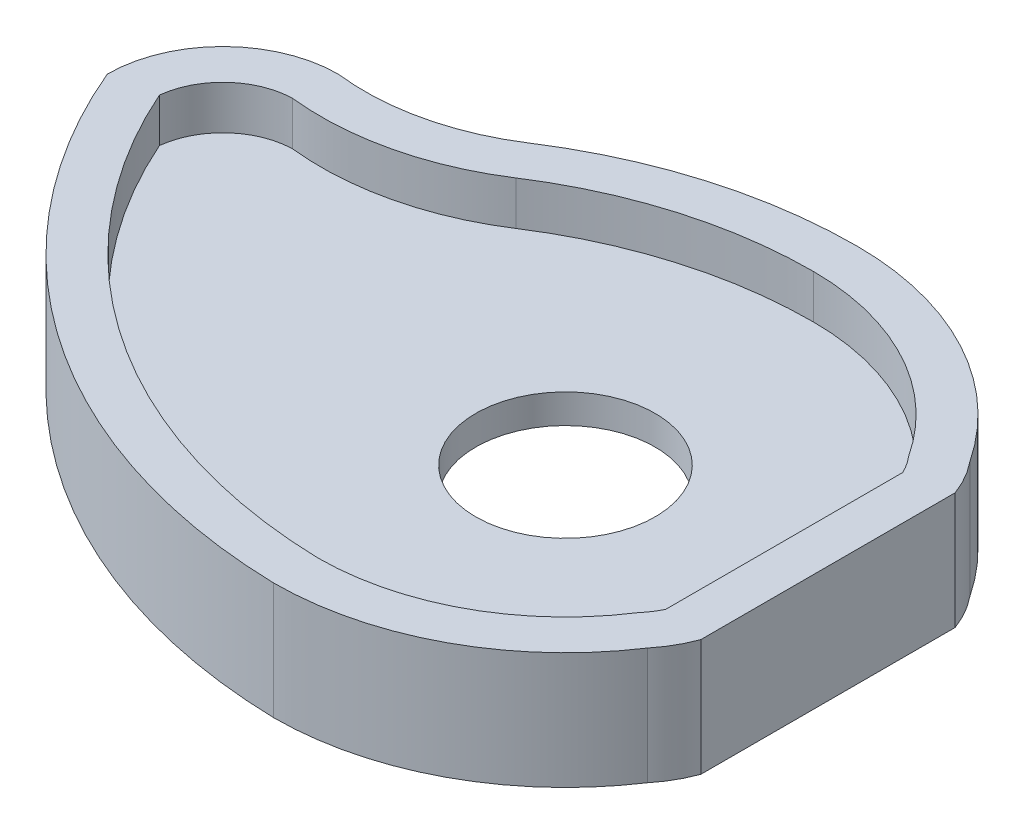
ISO-10303-21;
HEADER;
FILE_DESCRIPTION(('STEP AP214'),'2;1');
FILE_NAME('part.step','',(''),(''),'','','');
FILE_SCHEMA(('AUTOMOTIVE_DESIGN { 1 0 10303 214 1 1 1 1 }'));
ENDSEC;
DATA;
#1=APPLICATION_CONTEXT('core data for automotive mechanical design processes');
#2=APPLICATION_PROTOCOL_DEFINITION('international standard','automotive_design',2000,#1);
#3=PRODUCT_CONTEXT('',#1,'mechanical');
#4=PRODUCT('Part','Part','',(#3));
#5=PRODUCT_RELATED_PRODUCT_CATEGORY('part','',(#4));
#6=PRODUCT_DEFINITION_FORMATION('','',#4);
#7=PRODUCT_DEFINITION_CONTEXT('part definition',#1,'design');
#8=PRODUCT_DEFINITION('design','',#6,#7);
#9=PRODUCT_DEFINITION_SHAPE('','',#8);
#10=(LENGTH_UNIT() NAMED_UNIT(*) SI_UNIT(.MILLI.,.METRE.));
#11=(NAMED_UNIT(*) PLANE_ANGLE_UNIT() SI_UNIT($,.RADIAN.));
#12=(NAMED_UNIT(*) SI_UNIT($,.STERADIAN.) SOLID_ANGLE_UNIT());
#13=UNCERTAINTY_MEASURE_WITH_UNIT(LENGTH_MEASURE(1.E-05),#10,'distance_accuracy_value','');
#14=(GEOMETRIC_REPRESENTATION_CONTEXT(3) GLOBAL_UNCERTAINTY_ASSIGNED_CONTEXT((#13)) GLOBAL_UNIT_ASSIGNED_CONTEXT((#10,
#11,#12)) REPRESENTATION_CONTEXT('',''));
#15=CARTESIAN_POINT('',(0.,0.,0.));
#16=DIRECTION('',(0.,0.,1.));
#17=DIRECTION('',(1.,0.,0.));
#18=AXIS2_PLACEMENT_3D('',#15,#16,#17);
#19=CARTESIAN_POINT('',(0.,6.35,0.));
#20=DIRECTION('',(0.,1.,0.));
#21=DIRECTION('',(0.,0.,1.));
#22=AXIS2_PLACEMENT_3D('',#19,#20,#21);
#23=PLANE('',#22);
#24=CARTESIAN_POINT('',(0.,6.35,0.));
#25=DIRECTION('',(0.,1.,0.));
#26=DIRECTION('',(0.,0.,1.));
#27=AXIS2_PLACEMENT_3D('',#24,#25,#26);
#28=CIRCLE('',#27,39.05);
#29=CARTESIAN_POINT('',(0.,6.35,39.05));
#30=VERTEX_POINT('',#29);
#31=EDGE_CURVE('E277',#30,#30,#28,.T.);
#32=ORIENTED_EDGE('',*,*,#31,.F.);
#33=EDGE_LOOP('',(#32));
#34=FACE_BOUND('',#33,.T.);
#35=CARTESIAN_POINT('',(66.5686684634042,6.35,-37.9695149297598));
#36=DIRECTION('',(0.,1.,0.));
#37=DIRECTION('',(0.,0.,1.));
#38=AXIS2_PLACEMENT_3D('',#35,#36,#37);
#39=CIRCLE('',#38,31.75);
#40=CARTESIAN_POINT('',(95.25,6.35,-51.5872871883884));
#41=VERTEX_POINT('',#40);
#42=CARTESIAN_POINT('',(90.5312902277407,6.35,-58.7987073812051));
#43=VERTEX_POINT('',#42);
#44=EDGE_CURVE('E95',#41,#43,#39,.T.);
#45=ORIENTED_EDGE('',*,*,#44,.T.);
#46=CARTESIAN_POINT('',(0.,6.35,0.));
#47=DIRECTION('',(0.,1.,0.));
#48=DIRECTION('',(0.,0.,1.));
#49=AXIS2_PLACEMENT_3D('',#46,#47,#48);
#50=CIRCLE('',#49,107.95);
#51=CARTESIAN_POINT('',(0.,6.35,-107.95));
#52=VERTEX_POINT('',#51);
#53=EDGE_CURVE('E131',#43,#52,#50,.T.);
#54=ORIENTED_EDGE('',*,*,#53,.T.);
#55=CARTESIAN_POINT('',(0.,6.35,76.2));
#56=DIRECTION('',(0.,1.,0.));
#57=DIRECTION('',(0.,0.,1.));
#58=AXIS2_PLACEMENT_3D('',#55,#56,#57);
#59=CIRCLE('',#58,184.15);
#60=CARTESIAN_POINT('',(-99.98325505403,6.35,-78.4433678138212));
#61=VERTEX_POINT('',#60);
#62=EDGE_CURVE('E134',#52,#61,#59,.T.);
#63=ORIENTED_EDGE('',*,*,#62,.T.);
#64=CARTESIAN_POINT('',(-165.48952560667,6.35,-179.761436381497));
#65=DIRECTION('',(0.,1.,0.));
#66=DIRECTION('',(0.,0.,1.));
#67=AXIS2_PLACEMENT_3D('',#64,#65,#66);
#68=CIRCLE('',#67,120.65);
#69=CARTESIAN_POINT('',(-178.772455635616,6.35,-59.8448559188851));
#70=VERTEX_POINT('',#69);
#71=EDGE_CURVE('E137',#70,#61,#68,.T.);
#72=ORIENTED_EDGE('',*,*,#71,.F.);
#73=CARTESIAN_POINT('',(-177.8,6.35,-28.63));
#74=DIRECTION('',(0.,1.,0.));
#75=DIRECTION('',(0.,0.,1.));
#76=AXIS2_PLACEMENT_3D('',#73,#74,#75);
#77=CIRCLE('',#76,31.23);
#78=CARTESIAN_POINT('',(-208.836282510466,6.35,-32.1030487947266));
#79=VERTEX_POINT('',#78);
#80=EDGE_CURVE('E139',#79,#70,#77,.F.);
#81=ORIENTED_EDGE('',*,*,#80,.F.);
#82=CARTESIAN_POINT('',(6.12906951448226,6.35,-126.926041411445));
#83=DIRECTION('',(0.,1.,0.));
#84=DIRECTION('',(0.,0.,1.));
#85=AXIS2_PLACEMENT_3D('',#82,#83,#84);
#86=CIRCLE('',#85,234.95);
#87=CARTESIAN_POINT('',(0.225016949552153,6.35,107.949765480859));
#88=VERTEX_POINT('',#87);
#89=EDGE_CURVE('E142',#79,#88,#86,.T.);
#90=ORIENTED_EDGE('',*,*,#89,.T.);
#91=CARTESIAN_POINT('',(0.,6.35,0.));
#92=DIRECTION('',(0.,1.,0.));
#93=DIRECTION('',(0.,0.,1.));
#94=AXIS2_PLACEMENT_3D('',#91,#92,#93);
#95=CIRCLE('',#94,107.95);
#96=CARTESIAN_POINT('',(90.5312902277406,6.35,58.7987073812052));
#97=VERTEX_POINT('',#96);
#98=EDGE_CURVE('E145',#88,#97,#95,.T.);
#99=ORIENTED_EDGE('',*,*,#98,.T.);
#100=CARTESIAN_POINT('',(66.5686684634042,6.35,37.9695149297598));
#101=DIRECTION('',(0.,1.,0.));
#102=DIRECTION('',(0.,0.,1.));
#103=AXIS2_PLACEMENT_3D('',#100,#101,#102);
#104=CIRCLE('',#103,31.75);
#105=CARTESIAN_POINT('',(95.25,6.35,51.5872871883884));
#106=VERTEX_POINT('',#105);
#107=EDGE_CURVE('E49',#106,#97,#104,.F.);
#108=ORIENTED_EDGE('',*,*,#107,.F.);
#109=DIRECTION('',(0.,0.,1.));
#110=VECTOR('',#109,1.);
#111=CARTESIAN_POINT('',(95.25,6.35,0.));
#112=LINE('',#111,#110);
#113=EDGE_CURVE('E11',#41,#106,#112,.T.);
#114=ORIENTED_EDGE('',*,*,#113,.F.);
#115=EDGE_LOOP('',(#45,#54,#63,#72,#81,#90,#99,#108,#114));
#116=FACE_BOUND('',#115,.T.);
#117=ADVANCED_FACE('F39',(#34,#116),#23,.T.);
#118=CARTESIAN_POINT('',(0.,25.4,0.));
#119=DIRECTION('',(0.,-1.,0.));
#120=DIRECTION('',(0.,0.,-1.));
#121=AXIS2_PLACEMENT_3D('',#118,#119,#120);
#122=CYLINDRICAL_SURFACE('',#121,107.95);
#123=CARTESIAN_POINT('',(0.,-6.35,0.));
#124=DIRECTION('',(0.,1.,0.));
#125=DIRECTION('',(0.,0.,1.));
#126=AXIS2_PLACEMENT_3D('',#123,#124,#125);
#127=CIRCLE('',#126,107.95);
#128=CARTESIAN_POINT('',(90.5312902277407,-6.35,-58.7987073812051));
#129=VERTEX_POINT('',#128);
#130=CARTESIAN_POINT('',(0.,-6.35,-107.95));
#131=VERTEX_POINT('',#130);
#132=EDGE_CURVE('E151',#129,#131,#127,.T.);
#133=ORIENTED_EDGE('',*,*,#132,.T.);
#134=DIRECTION('',(0.,-1.,0.));
#135=VECTOR('',#134,1.);
#136=CARTESIAN_POINT('',(0.,25.4,-107.95));
#137=LINE('',#136,#135);
#138=CARTESIAN_POINT('',(0.,-25.4,-107.95));
#139=VERTEX_POINT('',#138);
#140=EDGE_CURVE('E272',#131,#139,#137,.T.);
#141=ORIENTED_EDGE('',*,*,#140,.T.);
#142=CARTESIAN_POINT('',(0.,-25.4,0.));
#143=DIRECTION('',(0.,1.,0.));
#144=DIRECTION('',(0.,0.,1.));
#145=AXIS2_PLACEMENT_3D('',#142,#143,#144);
#146=CIRCLE('',#145,107.95);
#147=CARTESIAN_POINT('',(90.5312902277407,-25.4,-58.7987073812051));
#148=VERTEX_POINT('',#147);
#149=EDGE_CURVE('E273',#148,#139,#146,.T.);
#150=ORIENTED_EDGE('',*,*,#149,.F.);
#151=DIRECTION('',(0.,-1.,0.));
#152=VECTOR('',#151,1.);
#153=CARTESIAN_POINT('',(90.5312902277407,25.4,-58.7987073812051));
#154=LINE('',#153,#152);
#155=EDGE_CURVE('E124',#129,#148,#154,.T.);
#156=ORIENTED_EDGE('',*,*,#155,.F.);
#157=EDGE_LOOP('',(#133,#141,#150,#156));
#158=FACE_BOUND('',#157,.T.);
#159=ADVANCED_FACE('F378',(#158),#122,.F.);
#160=CARTESIAN_POINT('',(66.5686684634042,25.4,-37.9695149297598));
#161=DIRECTION('',(0.,-1.,0.));
#162=DIRECTION('',(0.,0.,-1.));
#163=AXIS2_PLACEMENT_3D('',#160,#161,#162);
#164=CYLINDRICAL_SURFACE('',#163,31.75);
#165=CARTESIAN_POINT('',(66.5686684634042,-6.35,-37.9695149297598));
#166=DIRECTION('',(0.,1.,0.));
#167=DIRECTION('',(0.,0.,1.));
#168=AXIS2_PLACEMENT_3D('',#165,#166,#167);
#169=CIRCLE('',#168,31.75);
#170=CARTESIAN_POINT('',(95.25,-6.35,-51.5872871883884));
#171=VERTEX_POINT('',#170);
#172=EDGE_CURVE('E90',#171,#129,#169,.T.);
#173=ORIENTED_EDGE('',*,*,#172,.T.);
#174=ORIENTED_EDGE('',*,*,#155,.T.);
#175=CARTESIAN_POINT('',(66.5686684634042,-25.4,-37.9695149297598));
#176=DIRECTION('',(0.,1.,0.));
#177=DIRECTION('',(0.,0.,1.));
#178=AXIS2_PLACEMENT_3D('',#175,#176,#177);
#179=CIRCLE('',#178,31.75);
#180=CARTESIAN_POINT('',(95.25,-25.4,-51.5872871883884));
#181=VERTEX_POINT('',#180);
#182=EDGE_CURVE('E276',#181,#148,#179,.T.);
#183=ORIENTED_EDGE('',*,*,#182,.F.);
#184=DIRECTION('',(0.,-1.,0.));
#185=VECTOR('',#184,1.);
#186=CARTESIAN_POINT('',(95.25,25.4,-51.5872871883884));
#187=LINE('',#186,#185);
#188=EDGE_CURVE('E116',#171,#181,#187,.T.);
#189=ORIENTED_EDGE('',*,*,#188,.F.);
#190=EDGE_LOOP('',(#173,#174,#183,#189));
#191=FACE_BOUND('',#190,.T.);
#192=ADVANCED_FACE('F477',(#191),#164,.F.);
#193=CARTESIAN_POINT('',(95.25,25.4,0.));
#194=DIRECTION('',(1.,0.,0.));
#195=DIRECTION('',(0.,0.,-1.));
#196=AXIS2_PLACEMENT_3D('',#193,#194,#195);
#197=PLANE('',#196);
#198=DIRECTION('',(0.,-1.,0.));
#199=VECTOR('',#198,1.);
#200=CARTESIAN_POINT('',(95.25,25.4,51.5872871883884));
#201=LINE('',#200,#199);
#202=CARTESIAN_POINT('',(95.25,-6.35,51.5872871883884));
#203=VERTEX_POINT('',#202);
#204=CARTESIAN_POINT('',(95.25,-25.4,51.5872871883884));
#205=VERTEX_POINT('',#204);
#206=EDGE_CURVE('E102',#203,#205,#201,.T.);
#207=ORIENTED_EDGE('',*,*,#206,.F.);
#208=DIRECTION('',(0.,0.,1.));
#209=VECTOR('',#208,1.);
#210=CARTESIAN_POINT('',(95.25,-6.35,0.));
#211=LINE('',#210,#209);
#212=EDGE_CURVE('E85',#171,#203,#211,.T.);
#213=ORIENTED_EDGE('',*,*,#212,.F.);
#214=ORIENTED_EDGE('',*,*,#188,.T.);
#215=DIRECTION('',(0.,0.,1.));
#216=VECTOR('',#215,1.);
#217=CARTESIAN_POINT('',(95.25,-25.4,0.));
#218=LINE('',#217,#216);
#219=EDGE_CURVE('E110',#181,#205,#218,.T.);
#220=ORIENTED_EDGE('',*,*,#219,.T.);
#221=EDGE_LOOP('',(#207,#213,#214,#220));
#222=FACE_BOUND('',#221,.T.);
#223=ADVANCED_FACE('F108',(#222),#197,.F.);
#224=CARTESIAN_POINT('',(66.5686684634042,25.4,37.9695149297598));
#225=DIRECTION('',(0.,-1.,0.));
#226=DIRECTION('',(0.,0.,-1.));
#227=AXIS2_PLACEMENT_3D('',#224,#225,#226);
#228=CYLINDRICAL_SURFACE('',#227,31.75);
#229=DIRECTION('',(0.,-1.,0.));
#230=VECTOR('',#229,1.);
#231=CARTESIAN_POINT('',(90.5312902277406,25.4,58.7987073812052));
#232=LINE('',#231,#230);
#233=CARTESIAN_POINT('',(90.5312902277406,-6.35,58.7987073812052));
#234=VERTEX_POINT('',#233);
#235=CARTESIAN_POINT('',(90.5312902277406,-25.4,58.7987073812052));
#236=VERTEX_POINT('',#235);
#237=EDGE_CURVE('E105',#234,#236,#232,.T.);
#238=ORIENTED_EDGE('',*,*,#237,.F.);
#239=CARTESIAN_POINT('',(66.5686684634042,-6.35,37.9695149297598));
#240=DIRECTION('',(0.,1.,0.));
#241=DIRECTION('',(0.,0.,1.));
#242=AXIS2_PLACEMENT_3D('',#239,#240,#241);
#243=CIRCLE('',#242,31.75);
#244=EDGE_CURVE('E87',#203,#234,#243,.F.);
#245=ORIENTED_EDGE('',*,*,#244,.F.);
#246=ORIENTED_EDGE('',*,*,#206,.T.);
#247=CARTESIAN_POINT('',(66.5686684634042,-25.4,37.9695149297598));
#248=DIRECTION('',(0.,1.,0.));
#249=DIRECTION('',(0.,0.,1.));
#250=AXIS2_PLACEMENT_3D('',#247,#248,#249);
#251=CIRCLE('',#250,31.75);
#252=EDGE_CURVE('E281',#205,#236,#251,.F.);
#253=ORIENTED_EDGE('',*,*,#252,.T.);
#254=EDGE_LOOP('',(#238,#245,#246,#253));
#255=FACE_BOUND('',#254,.T.);
#256=ADVANCED_FACE('F99',(#255),#228,.F.);
#257=CARTESIAN_POINT('',(0.,25.4,0.));
#258=DIRECTION('',(0.,-1.,0.));
#259=DIRECTION('',(0.,0.,-1.));
#260=AXIS2_PLACEMENT_3D('',#257,#258,#259);
#261=CYLINDRICAL_SURFACE('',#260,107.95);
#262=CARTESIAN_POINT('',(0.,-6.35,0.));
#263=DIRECTION('',(0.,1.,0.));
#264=DIRECTION('',(0.,0.,1.));
#265=AXIS2_PLACEMENT_3D('',#262,#263,#264);
#266=CIRCLE('',#265,107.95);
#267=CARTESIAN_POINT('',(0.225016949552153,-6.35,107.949765480859));
#268=VERTEX_POINT('',#267);
#269=EDGE_CURVE('E106',#268,#234,#266,.T.);
#270=ORIENTED_EDGE('',*,*,#269,.T.);
#271=ORIENTED_EDGE('',*,*,#237,.T.);
#272=CARTESIAN_POINT('',(0.,-25.4,0.));
#273=DIRECTION('',(0.,1.,0.));
#274=DIRECTION('',(0.,0.,1.));
#275=AXIS2_PLACEMENT_3D('',#272,#273,#274);
#276=CIRCLE('',#275,107.95);
#277=CARTESIAN_POINT('',(0.225016949552153,-25.4,107.949765480859));
#278=VERTEX_POINT('',#277);
#279=EDGE_CURVE('E283',#278,#236,#276,.T.);
#280=ORIENTED_EDGE('',*,*,#279,.F.);
#281=DIRECTION('',(0.,-1.,0.));
#282=VECTOR('',#281,1.);
#283=CARTESIAN_POINT('',(0.225016949552153,25.4,107.949765480859));
#284=LINE('',#283,#282);
#285=EDGE_CURVE('E172',#268,#278,#284,.T.);
#286=ORIENTED_EDGE('',*,*,#285,.F.);
#287=EDGE_LOOP('',(#270,#271,#280,#286));
#288=FACE_BOUND('',#287,.T.);
#289=ADVANCED_FACE('F168',(#288),#261,.F.);
#290=CARTESIAN_POINT('',(6.12906951448226,25.4,-126.926041411445));
#291=DIRECTION('',(0.,-1.,0.));
#292=DIRECTION('',(0.,0.,-1.));
#293=AXIS2_PLACEMENT_3D('',#290,#291,#292);
#294=CYLINDRICAL_SURFACE('',#293,234.95);
#295=CARTESIAN_POINT('',(6.12906951448226,-6.35,-126.926041411445));
#296=DIRECTION('',(0.,1.,0.));
#297=DIRECTION('',(0.,0.,1.));
#298=AXIS2_PLACEMENT_3D('',#295,#296,#297);
#299=CIRCLE('',#298,234.95);
#300=CARTESIAN_POINT('',(-208.836282510466,-6.35,-32.1030487947266));
#301=VERTEX_POINT('',#300);
#302=EDGE_CURVE('E163',#301,#268,#299,.T.);
#303=ORIENTED_EDGE('',*,*,#302,.T.);
#304=ORIENTED_EDGE('',*,*,#285,.T.);
#305=CARTESIAN_POINT('',(6.12906951448226,-25.4,-126.926041411445));
#306=DIRECTION('',(0.,1.,0.));
#307=DIRECTION('',(0.,0.,1.));
#308=AXIS2_PLACEMENT_3D('',#305,#306,#307);
#309=CIRCLE('',#308,234.95);
#310=CARTESIAN_POINT('',(-208.836282510466,-25.4,-32.1030487947266));
#311=VERTEX_POINT('',#310);
#312=EDGE_CURVE('E183',#311,#278,#309,.T.);
#313=ORIENTED_EDGE('',*,*,#312,.F.);
#314=DIRECTION('',(0.,-1.,0.));
#315=VECTOR('',#314,1.);
#316=CARTESIAN_POINT('',(-208.836282510466,25.4,-32.1030487947266));
#317=LINE('',#316,#315);
#318=EDGE_CURVE('E180',#301,#311,#317,.T.);
#319=ORIENTED_EDGE('',*,*,#318,.F.);
#320=EDGE_LOOP('',(#303,#304,#313,#319));
#321=FACE_BOUND('',#320,.T.);
#322=ADVANCED_FACE('F176',(#321),#294,.F.);
#323=CARTESIAN_POINT('',(-177.8,25.4,-28.63));
#324=DIRECTION('',(0.,-1.,0.));
#325=DIRECTION('',(0.,0.,-1.));
#326=AXIS2_PLACEMENT_3D('',#323,#324,#325);
#327=CYLINDRICAL_SURFACE('',#326,31.23);
#328=DIRECTION('',(0.,-1.,0.));
#329=VECTOR('',#328,1.);
#330=CARTESIAN_POINT('',(-178.772455635616,25.4,-59.8448559188851));
#331=LINE('',#330,#329);
#332=CARTESIAN_POINT('',(-178.772455635616,-6.35,-59.8448559188851));
#333=VERTEX_POINT('',#332);
#334=CARTESIAN_POINT('',(-178.772455635616,-25.4,-59.8448559188851));
#335=VERTEX_POINT('',#334);
#336=EDGE_CURVE('E192',#333,#335,#331,.T.);
#337=ORIENTED_EDGE('',*,*,#336,.F.);
#338=CARTESIAN_POINT('',(-177.8,-6.35,-28.63));
#339=DIRECTION('',(0.,1.,0.));
#340=DIRECTION('',(0.,0.,1.));
#341=AXIS2_PLACEMENT_3D('',#338,#339,#340);
#342=CIRCLE('',#341,31.23);
#343=EDGE_CURVE('E161',#301,#333,#342,.F.);
#344=ORIENTED_EDGE('',*,*,#343,.F.);
#345=ORIENTED_EDGE('',*,*,#318,.T.);
#346=CARTESIAN_POINT('',(-177.8,-25.4,-28.63));
#347=DIRECTION('',(0.,1.,0.));
#348=DIRECTION('',(0.,0.,1.));
#349=AXIS2_PLACEMENT_3D('',#346,#347,#348);
#350=CIRCLE('',#349,31.23);
#351=EDGE_CURVE('E287',#311,#335,#350,.F.);
#352=ORIENTED_EDGE('',*,*,#351,.T.);
#353=EDGE_LOOP('',(#337,#344,#345,#352));
#354=FACE_BOUND('',#353,.T.);
#355=ADVANCED_FACE('F495',(#354),#327,.F.);
#356=CARTESIAN_POINT('',(-165.48952560667,25.4,-179.761436381497));
#357=DIRECTION('',(0.,-1.,0.));
#358=DIRECTION('',(0.,0.,-1.));
#359=AXIS2_PLACEMENT_3D('',#356,#357,#358);
#360=CYLINDRICAL_SURFACE('',#359,120.65);
#361=DIRECTION('',(0.,-1.,0.));
#362=VECTOR('',#361,1.);
#363=CARTESIAN_POINT('',(-99.98325505403,25.4,-78.4433678138212));
#364=LINE('',#363,#362);
#365=CARTESIAN_POINT('',(-99.98325505403,-6.35,-78.4433678138212));
#366=VERTEX_POINT('',#365);
#367=CARTESIAN_POINT('',(-99.98325505403,-25.4,-78.4433678138212));
#368=VERTEX_POINT('',#367);
#369=EDGE_CURVE('E350',#366,#368,#364,.T.);
#370=ORIENTED_EDGE('',*,*,#369,.F.);
#371=CARTESIAN_POINT('',(-165.48952560667,-6.35,-179.761436381497));
#372=DIRECTION('',(0.,1.,0.));
#373=DIRECTION('',(0.,0.,1.));
#374=AXIS2_PLACEMENT_3D('',#371,#372,#373);
#375=CIRCLE('',#374,120.65);
#376=EDGE_CURVE('E158',#333,#366,#375,.T.);
#377=ORIENTED_EDGE('',*,*,#376,.F.);
#378=ORIENTED_EDGE('',*,*,#336,.T.);
#379=CARTESIAN_POINT('',(-165.48952560667,-25.4,-179.761436381497));
#380=DIRECTION('',(0.,1.,0.));
#381=DIRECTION('',(0.,0.,1.));
#382=AXIS2_PLACEMENT_3D('',#379,#380,#381);
#383=CIRCLE('',#382,120.65);
#384=EDGE_CURVE('E289',#335,#368,#383,.T.);
#385=ORIENTED_EDGE('',*,*,#384,.T.);
#386=EDGE_LOOP('',(#370,#377,#378,#385));
#387=FACE_BOUND('',#386,.T.);
#388=ADVANCED_FACE('F365',(#387),#360,.T.);
#389=CARTESIAN_POINT('',(0.,25.4,76.2));
#390=DIRECTION('',(0.,-1.,0.));
#391=DIRECTION('',(0.,0.,-1.));
#392=AXIS2_PLACEMENT_3D('',#389,#390,#391);
#393=CYLINDRICAL_SURFACE('',#392,184.15);
#394=CARTESIAN_POINT('',(0.,-6.35,76.2));
#395=DIRECTION('',(0.,1.,0.));
#396=DIRECTION('',(0.,0.,1.));
#397=AXIS2_PLACEMENT_3D('',#394,#395,#396);
#398=CIRCLE('',#397,184.15);
#399=EDGE_CURVE('E155',#131,#366,#398,.T.);
#400=ORIENTED_EDGE('',*,*,#399,.T.);
#401=ORIENTED_EDGE('',*,*,#369,.T.);
#402=CARTESIAN_POINT('',(0.,-25.4,76.2));
#403=DIRECTION('',(0.,1.,0.));
#404=DIRECTION('',(0.,0.,1.));
#405=AXIS2_PLACEMENT_3D('',#402,#403,#404);
#406=CIRCLE('',#405,184.15);
#407=EDGE_CURVE('E292',#139,#368,#406,.T.);
#408=ORIENTED_EDGE('',*,*,#407,.F.);
#409=ORIENTED_EDGE('',*,*,#140,.F.);
#410=EDGE_LOOP('',(#400,#401,#408,#409));
#411=FACE_BOUND('',#410,.T.);
#412=ADVANCED_FACE('F357',(#411),#393,.F.);
#413=CARTESIAN_POINT('',(-177.8,25.4,-28.63));
#414=DIRECTION('',(0.,-1.,0.));
#415=DIRECTION('',(0.,0.,-1.));
#416=AXIS2_PLACEMENT_3D('',#413,#414,#415);
#417=CYLINDRICAL_SURFACE('',#416,50.28);
#418=CARTESIAN_POINT('',(-177.8,-25.4,-28.63));
#419=DIRECTION('',(0.,1.,0.));
#420=DIRECTION('',(0.,0.,1.));
#421=AXIS2_PLACEMENT_3D('',#418,#419,#420);
#422=CIRCLE('',#421,50.28);
#423=CARTESIAN_POINT('',(-228.08,-25.4,-28.63));
#424=VERTEX_POINT('',#423);
#425=CARTESIAN_POINT('',(-177.8,-25.4,-78.91));
#426=VERTEX_POINT('',#425);
#427=EDGE_CURVE('E295',#424,#426,#422,.F.);
#428=ORIENTED_EDGE('',*,*,#427,.F.);
#429=DIRECTION('',(0.,-1.,0.));
#430=VECTOR('',#429,1.);
#431=CARTESIAN_POINT('',(-228.08,25.4,-28.63));
#432=LINE('',#431,#430);
#433=CARTESIAN_POINT('',(-228.08,25.4,-28.63));
#434=VERTEX_POINT('',#433);
#435=EDGE_CURVE('E152',#434,#424,#432,.T.);
#436=ORIENTED_EDGE('',*,*,#435,.F.);
#437=CARTESIAN_POINT('',(-177.8,25.4,-28.63));
#438=DIRECTION('',(0.,1.,0.));
#439=DIRECTION('',(0.,0.,1.));
#440=AXIS2_PLACEMENT_3D('',#437,#438,#439);
#441=CIRCLE('',#440,50.28);
#442=CARTESIAN_POINT('',(-177.8,25.4,-78.91));
#443=VERTEX_POINT('',#442);
#444=EDGE_CURVE('E241',#434,#443,#441,.F.);
#445=ORIENTED_EDGE('',*,*,#444,.T.);
#446=DIRECTION('',(0.,-1.,0.));
#447=VECTOR('',#446,1.);
#448=CARTESIAN_POINT('',(-177.8,25.4,-78.91));
#449=LINE('',#448,#447);
#450=EDGE_CURVE('E128',#443,#426,#449,.T.);
#451=ORIENTED_EDGE('',*,*,#450,.T.);
#452=EDGE_LOOP('',(#428,#436,#445,#451));
#453=FACE_BOUND('',#452,.T.);
#454=ADVANCED_FACE('F502',(#453),#417,.T.);
#455=CARTESIAN_POINT('',(6.12906951448226,25.4,-126.926041411445));
#456=DIRECTION('',(0.,-1.,0.));
#457=DIRECTION('',(0.,0.,-1.));
#458=AXIS2_PLACEMENT_3D('',#455,#456,#457);
#459=CYLINDRICAL_SURFACE('',#458,254.);
#460=CARTESIAN_POINT('',(6.12906951448226,-25.4,-126.926041411445));
#461=DIRECTION('',(0.,1.,0.));
#462=DIRECTION('',(0.,0.,1.));
#463=AXIS2_PLACEMENT_3D('',#460,#461,#462);
#464=CIRCLE('',#463,254.);
#465=CARTESIAN_POINT('',(0.,-25.4,127.));
#466=VERTEX_POINT('',#465);
#467=EDGE_CURVE('E298',#424,#466,#464,.T.);
#468=ORIENTED_EDGE('',*,*,#467,.T.);
#469=DIRECTION('',(0.,-1.,0.));
#470=VECTOR('',#469,1.);
#471=CARTESIAN_POINT('',(0.,25.4,127.));
#472=LINE('',#471,#470);
#473=CARTESIAN_POINT('',(0.,25.4,127.));
#474=VERTEX_POINT('',#473);
#475=EDGE_CURVE('E343',#474,#466,#472,.T.);
#476=ORIENTED_EDGE('',*,*,#475,.F.);
#477=CARTESIAN_POINT('',(6.12906951448226,25.4,-126.926041411445));
#478=DIRECTION('',(0.,1.,0.));
#479=DIRECTION('',(0.,0.,1.));
#480=AXIS2_PLACEMENT_3D('',#477,#478,#479);
#481=CIRCLE('',#480,254.);
#482=EDGE_CURVE('E248',#434,#474,#481,.T.);
#483=ORIENTED_EDGE('',*,*,#482,.F.);
#484=ORIENTED_EDGE('',*,*,#435,.T.);
#485=EDGE_LOOP('',(#468,#476,#483,#484));
#486=FACE_BOUND('',#485,.T.);
#487=ADVANCED_FACE('F505',(#486),#459,.T.);
#488=CARTESIAN_POINT('',(0.,25.4,0.));
#489=DIRECTION('',(0.,-1.,0.));
#490=DIRECTION('',(0.,0.,-1.));
#491=AXIS2_PLACEMENT_3D('',#488,#489,#490);
#492=CYLINDRICAL_SURFACE('',#491,127.);
#493=CARTESIAN_POINT('',(0.,-25.4,0.));
#494=DIRECTION('',(0.,1.,0.));
#495=DIRECTION('',(0.,0.,1.));
#496=AXIS2_PLACEMENT_3D('',#493,#494,#495);
#497=CIRCLE('',#496,127.);
#498=CARTESIAN_POINT('',(105.833333333333,-25.4,70.2018913958561));
#499=VERTEX_POINT('',#498);
#500=EDGE_CURVE('E301',#466,#499,#497,.T.);
#501=ORIENTED_EDGE('',*,*,#500,.T.);
#502=DIRECTION('',(0.,-1.,0.));
#503=VECTOR('',#502,1.);
#504=CARTESIAN_POINT('',(105.833333333333,25.4,70.2018913958561));
#505=LINE('',#504,#503);
#506=CARTESIAN_POINT('',(105.833333333333,25.4,70.2018913958561));
#507=VERTEX_POINT('',#506);
#508=EDGE_CURVE('E340',#507,#499,#505,.T.);
#509=ORIENTED_EDGE('',*,*,#508,.F.);
#510=CARTESIAN_POINT('',(0.,25.4,0.));
#511=DIRECTION('',(0.,1.,0.));
#512=DIRECTION('',(0.,0.,1.));
#513=AXIS2_PLACEMENT_3D('',#510,#511,#512);
#514=CIRCLE('',#513,127.);
#515=EDGE_CURVE('E251',#474,#507,#514,.T.);
#516=ORIENTED_EDGE('',*,*,#515,.F.);
#517=ORIENTED_EDGE('',*,*,#475,.T.);
#518=EDGE_LOOP('',(#501,#509,#516,#517));
#519=FACE_BOUND('',#518,.T.);
#520=ADVANCED_FACE('F509',(#519),#492,.T.);
#521=CARTESIAN_POINT('',(66.5686684634042,25.4,37.9695149297598));
#522=DIRECTION('',(0.,-1.,0.));
#523=DIRECTION('',(0.,0.,-1.));
#524=AXIS2_PLACEMENT_3D('',#521,#522,#523);
#525=CYLINDRICAL_SURFACE('',#524,50.8);
#526=CARTESIAN_POINT('',(66.5686684634042,-25.4,37.9695149297598));
#527=DIRECTION('',(0.,1.,0.));
#528=DIRECTION('',(0.,0.,1.));
#529=AXIS2_PLACEMENT_3D('',#526,#527,#528);
#530=CIRCLE('',#529,50.8);
#531=CARTESIAN_POINT('',(114.3,-25.4,55.3580165829665));
#532=VERTEX_POINT('',#531);
#533=EDGE_CURVE('E304',#532,#499,#530,.F.);
#534=ORIENTED_EDGE('',*,*,#533,.F.);
#535=DIRECTION('',(0.,-1.,0.));
#536=VECTOR('',#535,1.);
#537=CARTESIAN_POINT('',(114.3,25.4,55.3580165829665));
#538=LINE('',#537,#536);
#539=CARTESIAN_POINT('',(114.3,25.4,55.3580165829665));
#540=VERTEX_POINT('',#539);
#541=EDGE_CURVE('E337',#540,#532,#538,.T.);
#542=ORIENTED_EDGE('',*,*,#541,.F.);
#543=CARTESIAN_POINT('',(66.5686684634042,25.4,37.9695149297598));
#544=DIRECTION('',(0.,1.,0.));
#545=DIRECTION('',(0.,0.,1.));
#546=AXIS2_PLACEMENT_3D('',#543,#544,#545);
#547=CIRCLE('',#546,50.8);
#548=EDGE_CURVE('E254',#540,#507,#547,.F.);
#549=ORIENTED_EDGE('',*,*,#548,.T.);
#550=ORIENTED_EDGE('',*,*,#508,.T.);
#551=EDGE_LOOP('',(#534,#542,#549,#550));
#552=FACE_BOUND('',#551,.T.);
#553=ADVANCED_FACE('F513',(#552),#525,.T.);
#554=CARTESIAN_POINT('',(114.3,25.4,0.));
#555=DIRECTION('',(1.,0.,0.));
#556=DIRECTION('',(0.,0.,-1.));
#557=AXIS2_PLACEMENT_3D('',#554,#555,#556);
#558=PLANE('',#557);
#559=DIRECTION('',(0.,0.,1.));
#560=VECTOR('',#559,1.);
#561=CARTESIAN_POINT('',(114.3,-25.4,0.));
#562=LINE('',#561,#560);
#563=CARTESIAN_POINT('',(114.3,-25.4,-55.3580165829665));
#564=VERTEX_POINT('',#563);
#565=EDGE_CURVE('E307',#564,#532,#562,.T.);
#566=ORIENTED_EDGE('',*,*,#565,.F.);
#567=DIRECTION('',(0.,-1.,0.));
#568=VECTOR('',#567,1.);
#569=CARTESIAN_POINT('',(114.3,25.4,-55.3580165829665));
#570=LINE('',#569,#568);
#571=CARTESIAN_POINT('',(114.3,25.4,-55.3580165829665));
#572=VERTEX_POINT('',#571);
#573=EDGE_CURVE('E334',#572,#564,#570,.T.);
#574=ORIENTED_EDGE('',*,*,#573,.F.);
#575=DIRECTION('',(0.,0.,1.));
#576=VECTOR('',#575,1.);
#577=CARTESIAN_POINT('',(114.3,25.4,0.));
#578=LINE('',#577,#576);
#579=EDGE_CURVE('E257',#572,#540,#578,.T.);
#580=ORIENTED_EDGE('',*,*,#579,.T.);
#581=ORIENTED_EDGE('',*,*,#541,.T.);
#582=EDGE_LOOP('',(#566,#574,#580,#581));
#583=FACE_BOUND('',#582,.T.);
#584=ADVANCED_FACE('F517',(#583),#558,.T.);
#585=CARTESIAN_POINT('',(66.5686684634042,25.4,-37.9695149297598));
#586=DIRECTION('',(0.,-1.,0.));
#587=DIRECTION('',(0.,0.,-1.));
#588=AXIS2_PLACEMENT_3D('',#585,#586,#587);
#589=CYLINDRICAL_SURFACE('',#588,50.8);
#590=CARTESIAN_POINT('',(66.5686684634042,-25.4,-37.9695149297598));
#591=DIRECTION('',(0.,1.,0.));
#592=DIRECTION('',(0.,0.,1.));
#593=AXIS2_PLACEMENT_3D('',#590,#591,#592);
#594=CIRCLE('',#593,50.8);
#595=CARTESIAN_POINT('',(105.833333333333,-25.4,-70.2018913958561));
#596=VERTEX_POINT('',#595);
#597=EDGE_CURVE('E310',#564,#596,#594,.T.);
#598=ORIENTED_EDGE('',*,*,#597,.T.);
#599=DIRECTION('',(0.,-1.,0.));
#600=VECTOR('',#599,1.);
#601=CARTESIAN_POINT('',(105.833333333333,25.4,-70.2018913958561));
#602=LINE('',#601,#600);
#603=CARTESIAN_POINT('',(105.833333333333,25.4,-70.2018913958561));
#604=VERTEX_POINT('',#603);
#605=EDGE_CURVE('E331',#604,#596,#602,.T.);
#606=ORIENTED_EDGE('',*,*,#605,.F.);
#607=CARTESIAN_POINT('',(66.5686684634042,25.4,-37.9695149297598));
#608=DIRECTION('',(0.,1.,0.));
#609=DIRECTION('',(0.,0.,1.));
#610=AXIS2_PLACEMENT_3D('',#607,#608,#609);
#611=CIRCLE('',#610,50.8);
#612=EDGE_CURVE('E260',#572,#604,#611,.T.);
#613=ORIENTED_EDGE('',*,*,#612,.F.);
#614=ORIENTED_EDGE('',*,*,#573,.T.);
#615=EDGE_LOOP('',(#598,#606,#613,#614));
#616=FACE_BOUND('',#615,.T.);
#617=ADVANCED_FACE('F521',(#616),#589,.T.);
#618=CARTESIAN_POINT('',(0.,25.4,0.));
#619=DIRECTION('',(0.,-1.,0.));
#620=DIRECTION('',(0.,0.,-1.));
#621=AXIS2_PLACEMENT_3D('',#618,#619,#620);
#622=CYLINDRICAL_SURFACE('',#621,127.);
#623=CARTESIAN_POINT('',(0.,-25.4,0.));
#624=DIRECTION('',(0.,1.,0.));
#625=DIRECTION('',(0.,0.,1.));
#626=AXIS2_PLACEMENT_3D('',#623,#624,#625);
#627=CIRCLE('',#626,127.);
#628=CARTESIAN_POINT('',(0.,-25.4,-127.));
#629=VERTEX_POINT('',#628);
#630=EDGE_CURVE('E313',#596,#629,#627,.T.);
#631=ORIENTED_EDGE('',*,*,#630,.T.);
#632=DIRECTION('',(0.,-1.,0.));
#633=VECTOR('',#632,1.);
#634=CARTESIAN_POINT('',(0.,25.4,-127.));
#635=LINE('',#634,#633);
#636=CARTESIAN_POINT('',(0.,25.4,-127.));
#637=VERTEX_POINT('',#636);
#638=EDGE_CURVE('E328',#637,#629,#635,.T.);
#639=ORIENTED_EDGE('',*,*,#638,.F.);
#640=CARTESIAN_POINT('',(0.,25.4,0.));
#641=DIRECTION('',(0.,1.,0.));
#642=DIRECTION('',(0.,0.,1.));
#643=AXIS2_PLACEMENT_3D('',#640,#641,#642);
#644=CIRCLE('',#643,127.);
#645=EDGE_CURVE('E263',#604,#637,#644,.T.);
#646=ORIENTED_EDGE('',*,*,#645,.F.);
#647=ORIENTED_EDGE('',*,*,#605,.T.);
#648=EDGE_LOOP('',(#631,#639,#646,#647));
#649=FACE_BOUND('',#648,.T.);
#650=ADVANCED_FACE('F525',(#649),#622,.T.);
#651=CARTESIAN_POINT('',(0.,25.4,76.2));
#652=DIRECTION('',(0.,-1.,0.));
#653=DIRECTION('',(0.,0.,-1.));
#654=AXIS2_PLACEMENT_3D('',#651,#652,#653);
#655=CYLINDRICAL_SURFACE('',#654,203.2);
#656=CARTESIAN_POINT('',(0.,-25.4,76.2));
#657=DIRECTION('',(0.,1.,0.));
#658=DIRECTION('',(0.,0.,1.));
#659=AXIS2_PLACEMENT_3D('',#656,#657,#658);
#660=CIRCLE('',#659,203.2);
#661=CARTESIAN_POINT('',(-110.326350404447,-25.4,-94.4409575876649));
#662=VERTEX_POINT('',#661);
#663=EDGE_CURVE('E316',#629,#662,#660,.T.);
#664=ORIENTED_EDGE('',*,*,#663,.T.);
#665=DIRECTION('',(0.,-1.,0.));
#666=VECTOR('',#665,1.);
#667=CARTESIAN_POINT('',(-110.326350404447,25.4,-94.4409575876649));
#668=LINE('',#667,#666);
#669=CARTESIAN_POINT('',(-110.326350404447,25.4,-94.4409575876649));
#670=VERTEX_POINT('',#669);
#671=EDGE_CURVE('E325',#670,#662,#668,.T.);
#672=ORIENTED_EDGE('',*,*,#671,.F.);
#673=CARTESIAN_POINT('',(0.,25.4,76.2));
#674=DIRECTION('',(0.,1.,0.));
#675=DIRECTION('',(0.,0.,1.));
#676=AXIS2_PLACEMENT_3D('',#673,#674,#675);
#677=CIRCLE('',#676,203.2);
#678=EDGE_CURVE('E266',#637,#670,#677,.T.);
#679=ORIENTED_EDGE('',*,*,#678,.F.);
#680=ORIENTED_EDGE('',*,*,#638,.T.);
#681=EDGE_LOOP('',(#664,#672,#679,#680));
#682=FACE_BOUND('',#681,.T.);
#683=ADVANCED_FACE('F481',(#682),#655,.T.);
#684=CARTESIAN_POINT('',(0.,25.4,-107.95));
#685=VERTEX_POINT('',#684);
#686=EDGE_CURVE('E348',#685,#52,#137,.T.);
#687=ORIENTED_EDGE('',*,*,#686,.T.);
#688=ORIENTED_EDGE('',*,*,#53,.F.);
#689=CARTESIAN_POINT('',(90.5312902277407,25.4,-58.7987073812051));
#690=VERTEX_POINT('',#689);
#691=EDGE_CURVE('E125',#690,#43,#154,.T.);
#692=ORIENTED_EDGE('',*,*,#691,.F.);
#693=CARTESIAN_POINT('',(0.,25.4,0.));
#694=DIRECTION('',(0.,1.,0.));
#695=DIRECTION('',(0.,0.,1.));
#696=AXIS2_PLACEMENT_3D('',#693,#694,#695);
#697=CIRCLE('',#696,107.95);
#698=EDGE_CURVE('E322',#690,#685,#697,.T.);
#699=ORIENTED_EDGE('',*,*,#698,.T.);
#700=EDGE_LOOP('',(#687,#688,#692,#699));
#701=FACE_BOUND('',#700,.T.);
#702=ADVANCED_FACE('F426',(#701),#122,.F.);
#703=ORIENTED_EDGE('',*,*,#691,.T.);
#704=ORIENTED_EDGE('',*,*,#44,.F.);
#705=CARTESIAN_POINT('',(95.25,25.4,-51.5872871883884));
#706=VERTEX_POINT('',#705);
#707=EDGE_CURVE('E121',#706,#41,#187,.T.);
#708=ORIENTED_EDGE('',*,*,#707,.F.);
#709=CARTESIAN_POINT('',(66.5686684634042,25.4,-37.9695149297598));
#710=DIRECTION('',(0.,1.,0.));
#711=DIRECTION('',(0.,0.,1.));
#712=AXIS2_PLACEMENT_3D('',#709,#710,#711);
#713=CIRCLE('',#712,31.75);
#714=EDGE_CURVE('E433',#706,#690,#713,.T.);
#715=ORIENTED_EDGE('',*,*,#714,.T.);
#716=EDGE_LOOP('',(#703,#704,#708,#715));
#717=FACE_BOUND('',#716,.T.);
#718=ADVANCED_FACE('F431',(#717),#164,.F.);
#719=ORIENTED_EDGE('',*,*,#113,.T.);
#720=CARTESIAN_POINT('',(95.25,25.4,51.5872871883884));
#721=VERTEX_POINT('',#720);
#722=EDGE_CURVE('E112',#721,#106,#201,.T.);
#723=ORIENTED_EDGE('',*,*,#722,.F.);
#724=DIRECTION('',(0.,0.,1.));
#725=VECTOR('',#724,1.);
#726=CARTESIAN_POINT('',(95.25,25.4,0.));
#727=LINE('',#726,#725);
#728=EDGE_CURVE('E451',#706,#721,#727,.T.);
#729=ORIENTED_EDGE('',*,*,#728,.F.);
#730=ORIENTED_EDGE('',*,*,#707,.T.);
#731=EDGE_LOOP('',(#719,#723,#729,#730));
#732=FACE_BOUND('',#731,.T.);
#733=ADVANCED_FACE('F437',(#732),#197,.F.);
#734=ORIENTED_EDGE('',*,*,#107,.T.);
#735=CARTESIAN_POINT('',(90.5312902277406,25.4,58.7987073812052));
#736=VERTEX_POINT('',#735);
#737=EDGE_CURVE('E113',#736,#97,#232,.T.);
#738=ORIENTED_EDGE('',*,*,#737,.F.);
#739=CARTESIAN_POINT('',(66.5686684634042,25.4,37.9695149297598));
#740=DIRECTION('',(0.,1.,0.));
#741=DIRECTION('',(0.,0.,1.));
#742=AXIS2_PLACEMENT_3D('',#739,#740,#741);
#743=CIRCLE('',#742,31.75);
#744=EDGE_CURVE('E445',#721,#736,#743,.F.);
#745=ORIENTED_EDGE('',*,*,#744,.F.);
#746=ORIENTED_EDGE('',*,*,#722,.T.);
#747=EDGE_LOOP('',(#734,#738,#745,#746));
#748=FACE_BOUND('',#747,.T.);
#749=ADVANCED_FACE('F442',(#748),#228,.F.);
#750=ORIENTED_EDGE('',*,*,#737,.T.);
#751=ORIENTED_EDGE('',*,*,#98,.F.);
#752=CARTESIAN_POINT('',(0.225016949552153,25.4,107.949765480859));
#753=VERTEX_POINT('',#752);
#754=EDGE_CURVE('E195',#753,#88,#284,.T.);
#755=ORIENTED_EDGE('',*,*,#754,.F.);
#756=CARTESIAN_POINT('',(0.,25.4,0.));
#757=DIRECTION('',(0.,1.,0.));
#758=DIRECTION('',(0.,0.,1.));
#759=AXIS2_PLACEMENT_3D('',#756,#757,#758);
#760=CIRCLE('',#759,107.95);
#761=EDGE_CURVE('E450',#753,#736,#760,.T.);
#762=ORIENTED_EDGE('',*,*,#761,.T.);
#763=EDGE_LOOP('',(#750,#751,#755,#762));
#764=FACE_BOUND('',#763,.T.);
#765=ADVANCED_FACE('F488',(#764),#261,.F.);
#766=ORIENTED_EDGE('',*,*,#754,.T.);
#767=ORIENTED_EDGE('',*,*,#89,.F.);
#768=CARTESIAN_POINT('',(-208.836282510466,25.4,-32.1030487947266));
#769=VERTEX_POINT('',#768);
#770=EDGE_CURVE('E187',#769,#79,#317,.T.);
#771=ORIENTED_EDGE('',*,*,#770,.F.);
#772=CARTESIAN_POINT('',(6.12906951448226,25.4,-126.926041411445));
#773=DIRECTION('',(0.,1.,0.));
#774=DIRECTION('',(0.,0.,1.));
#775=AXIS2_PLACEMENT_3D('',#772,#773,#774);
#776=CIRCLE('',#775,234.95);
#777=EDGE_CURVE('E207',#769,#753,#776,.T.);
#778=ORIENTED_EDGE('',*,*,#777,.T.);
#779=EDGE_LOOP('',(#766,#767,#771,#778));
#780=FACE_BOUND('',#779,.T.);
#781=ADVANCED_FACE('F202',(#780),#294,.F.);
#782=ORIENTED_EDGE('',*,*,#80,.T.);
#783=CARTESIAN_POINT('',(-178.772455635616,25.4,-59.8448559188851));
#784=VERTEX_POINT('',#783);
#785=EDGE_CURVE('E188',#784,#70,#331,.T.);
#786=ORIENTED_EDGE('',*,*,#785,.F.);
#787=CARTESIAN_POINT('',(-177.8,25.4,-28.63));
#788=DIRECTION('',(0.,1.,0.));
#789=DIRECTION('',(0.,0.,1.));
#790=AXIS2_PLACEMENT_3D('',#787,#788,#789);
#791=CIRCLE('',#790,31.23);
#792=EDGE_CURVE('E239',#769,#784,#791,.F.);
#793=ORIENTED_EDGE('',*,*,#792,.F.);
#794=ORIENTED_EDGE('',*,*,#770,.T.);
#795=EDGE_LOOP('',(#782,#786,#793,#794));
#796=FACE_BOUND('',#795,.T.);
#797=ADVANCED_FACE('F222',(#796),#327,.F.);
#798=ORIENTED_EDGE('',*,*,#71,.T.);
#799=CARTESIAN_POINT('',(-99.98325505403,25.4,-78.4433678138212));
#800=VERTEX_POINT('',#799);
#801=EDGE_CURVE('E57',#800,#61,#364,.T.);
#802=ORIENTED_EDGE('',*,*,#801,.F.);
#803=CARTESIAN_POINT('',(-165.48952560667,25.4,-179.761436381497));
#804=DIRECTION('',(0.,1.,0.));
#805=DIRECTION('',(0.,0.,1.));
#806=AXIS2_PLACEMENT_3D('',#803,#804,#805);
#807=CIRCLE('',#806,120.65);
#808=EDGE_CURVE('E231',#784,#800,#807,.T.);
#809=ORIENTED_EDGE('',*,*,#808,.F.);
#810=ORIENTED_EDGE('',*,*,#785,.T.);
#811=EDGE_LOOP('',(#798,#802,#809,#810));
#812=FACE_BOUND('',#811,.T.);
#813=ADVANCED_FACE('F229',(#812),#360,.T.);
#814=ORIENTED_EDGE('',*,*,#801,.T.);
#815=ORIENTED_EDGE('',*,*,#62,.F.);
#816=ORIENTED_EDGE('',*,*,#686,.F.);
#817=CARTESIAN_POINT('',(0.,25.4,76.2));
#818=DIRECTION('',(0.,1.,0.));
#819=DIRECTION('',(0.,0.,1.));
#820=AXIS2_PLACEMENT_3D('',#817,#818,#819);
#821=CIRCLE('',#820,184.15);
#822=EDGE_CURVE('E238',#685,#800,#821,.T.);
#823=ORIENTED_EDGE('',*,*,#822,.T.);
#824=EDGE_LOOP('',(#814,#815,#816,#823));
#825=FACE_BOUND('',#824,.T.);
#826=ADVANCED_FACE('F498',(#825),#393,.F.);
#827=CARTESIAN_POINT('',(-165.48952560667,25.4,-179.761436381497));
#828=DIRECTION('',(0.,-1.,0.));
#829=DIRECTION('',(0.,0.,-1.));
#830=AXIS2_PLACEMENT_3D('',#827,#828,#829);
#831=CYLINDRICAL_SURFACE('',#830,101.6);
#832=CARTESIAN_POINT('',(-165.48952560667,-25.4,-179.761436381497));
#833=DIRECTION('',(0.,1.,0.));
#834=DIRECTION('',(0.,0.,1.));
#835=AXIS2_PLACEMENT_3D('',#832,#833,#834);
#836=CIRCLE('',#835,101.6);
#837=EDGE_CURVE('E319',#426,#662,#836,.T.);
#838=ORIENTED_EDGE('',*,*,#837,.F.);
#839=ORIENTED_EDGE('',*,*,#450,.F.);
#840=CARTESIAN_POINT('',(-165.48952560667,25.4,-179.761436381497));
#841=DIRECTION('',(0.,1.,0.));
#842=DIRECTION('',(0.,0.,1.));
#843=AXIS2_PLACEMENT_3D('',#840,#841,#842);
#844=CIRCLE('',#843,101.6);
#845=EDGE_CURVE('E269',#443,#670,#844,.T.);
#846=ORIENTED_EDGE('',*,*,#845,.T.);
#847=ORIENTED_EDGE('',*,*,#671,.T.);
#848=EDGE_LOOP('',(#838,#839,#846,#847));
#849=FACE_BOUND('',#848,.T.);
#850=ADVANCED_FACE('F501',(#849),#831,.F.);
#851=CARTESIAN_POINT('',(0.,25.4,0.));
#852=DIRECTION('',(0.,1.,0.));
#853=DIRECTION('',(0.,0.,1.));
#854=AXIS2_PLACEMENT_3D('',#851,#852,#853);
#855=PLANE('',#854);
#856=ORIENTED_EDGE('',*,*,#698,.F.);
#857=ORIENTED_EDGE('',*,*,#714,.F.);
#858=ORIENTED_EDGE('',*,*,#728,.T.);
#859=ORIENTED_EDGE('',*,*,#744,.T.);
#860=ORIENTED_EDGE('',*,*,#761,.F.);
#861=ORIENTED_EDGE('',*,*,#777,.F.);
#862=ORIENTED_EDGE('',*,*,#792,.T.);
#863=ORIENTED_EDGE('',*,*,#808,.T.);
#864=ORIENTED_EDGE('',*,*,#822,.F.);
#865=EDGE_LOOP('',(#856,#857,#858,#859,#860,#861,#862,#863,#864));
#866=FACE_BOUND('',#865,.T.);
#867=ORIENTED_EDGE('',*,*,#444,.F.);
#868=ORIENTED_EDGE('',*,*,#482,.T.);
#869=ORIENTED_EDGE('',*,*,#515,.T.);
#870=ORIENTED_EDGE('',*,*,#548,.F.);
#871=ORIENTED_EDGE('',*,*,#579,.F.);
#872=ORIENTED_EDGE('',*,*,#612,.T.);
#873=ORIENTED_EDGE('',*,*,#645,.T.);
#874=ORIENTED_EDGE('',*,*,#678,.T.);
#875=ORIENTED_EDGE('',*,*,#845,.F.);
#876=EDGE_LOOP('',(#867,#868,#869,#870,#871,#872,#873,#874,#875));
#877=FACE_BOUND('',#876,.T.);
#878=ADVANCED_FACE('F535',(#866,#877),#855,.T.);
#879=CARTESIAN_POINT('',(0.,-25.4,0.));
#880=DIRECTION('',(0.,1.,0.));
#881=DIRECTION('',(0.,0.,1.));
#882=AXIS2_PLACEMENT_3D('',#879,#880,#881);
#883=PLANE('',#882);
#884=ORIENTED_EDGE('',*,*,#149,.T.);
#885=ORIENTED_EDGE('',*,*,#407,.T.);
#886=ORIENTED_EDGE('',*,*,#384,.F.);
#887=ORIENTED_EDGE('',*,*,#351,.F.);
#888=ORIENTED_EDGE('',*,*,#312,.T.);
#889=ORIENTED_EDGE('',*,*,#279,.T.);
#890=ORIENTED_EDGE('',*,*,#252,.F.);
#891=ORIENTED_EDGE('',*,*,#219,.F.);
#892=ORIENTED_EDGE('',*,*,#182,.T.);
#893=EDGE_LOOP('',(#884,#885,#886,#887,#888,#889,#890,#891,#892));
#894=FACE_BOUND('',#893,.T.);
#895=ORIENTED_EDGE('',*,*,#427,.T.);
#896=ORIENTED_EDGE('',*,*,#837,.T.);
#897=ORIENTED_EDGE('',*,*,#663,.F.);
#898=ORIENTED_EDGE('',*,*,#630,.F.);
#899=ORIENTED_EDGE('',*,*,#597,.F.);
#900=ORIENTED_EDGE('',*,*,#565,.T.);
#901=ORIENTED_EDGE('',*,*,#533,.T.);
#902=ORIENTED_EDGE('',*,*,#500,.F.);
#903=ORIENTED_EDGE('',*,*,#467,.F.);
#904=EDGE_LOOP('',(#895,#896,#897,#898,#899,#900,#901,#902,#903));
#905=FACE_BOUND('',#904,.T.);
#906=ADVANCED_FACE('F368',(#894,#905),#883,.F.);
#907=CARTESIAN_POINT('',(0.,-6.35,0.));
#908=DIRECTION('',(0.,1.,0.));
#909=DIRECTION('',(0.,0.,1.));
#910=AXIS2_PLACEMENT_3D('',#907,#908,#909);
#911=PLANE('',#910);
#912=CARTESIAN_POINT('',(0.,-6.35,0.));
#913=DIRECTION('',(0.,1.,0.));
#914=DIRECTION('',(0.,0.,1.));
#915=AXIS2_PLACEMENT_3D('',#912,#913,#914);
#916=CIRCLE('',#915,39.05);
#917=CARTESIAN_POINT('',(0.,-6.35,39.05));
#918=VERTEX_POINT('',#917);
#919=EDGE_CURVE('E43',#918,#918,#916,.T.);
#920=ORIENTED_EDGE('',*,*,#919,.T.);
#921=EDGE_LOOP('',(#920));
#922=FACE_BOUND('',#921,.T.);
#923=ORIENTED_EDGE('',*,*,#172,.F.);
#924=ORIENTED_EDGE('',*,*,#212,.T.);
#925=ORIENTED_EDGE('',*,*,#244,.T.);
#926=ORIENTED_EDGE('',*,*,#269,.F.);
#927=ORIENTED_EDGE('',*,*,#302,.F.);
#928=ORIENTED_EDGE('',*,*,#343,.T.);
#929=ORIENTED_EDGE('',*,*,#376,.T.);
#930=ORIENTED_EDGE('',*,*,#399,.F.);
#931=ORIENTED_EDGE('',*,*,#132,.F.);
#932=EDGE_LOOP('',(#923,#924,#925,#926,#927,#928,#929,#930,#931));
#933=FACE_BOUND('',#932,.T.);
#934=ADVANCED_FACE('F41',(#922,#933),#911,.F.);
#935=CARTESIAN_POINT('',(0.,-25.4,0.));
#936=DIRECTION('',(0.,1.,0.));
#937=DIRECTION('',(0.,0.,1.));
#938=AXIS2_PLACEMENT_3D('',#935,#936,#937);
#939=CYLINDRICAL_SURFACE('',#938,39.05);
#940=ORIENTED_EDGE('',*,*,#31,.T.);
#941=EDGE_LOOP('',(#940));
#942=FACE_BOUND('',#941,.T.);
#943=ORIENTED_EDGE('',*,*,#919,.F.);
#944=EDGE_LOOP('',(#943));
#945=FACE_BOUND('',#944,.T.);
#946=ADVANCED_FACE('F465',(#942,#945),#939,.F.);
#947=CLOSED_SHELL('',(#117,#159,#192,#223,#256,#289,#322,#355,#388,#412,#454,#487,#520,#553,
#584,#617,#650,#683,#702,#718,#733,#749,#765,#781,#797,#813,#826,#850,#878,#906,#934,#946));
#948=MANIFOLD_SOLID_BREP('B2',#947);
#949=ADVANCED_BREP_SHAPE_REPRESENTATION('',(#18,#948),#14);
#950=SHAPE_DEFINITION_REPRESENTATION(#9,#949);
ENDSEC;
END-ISO-10303-21;
